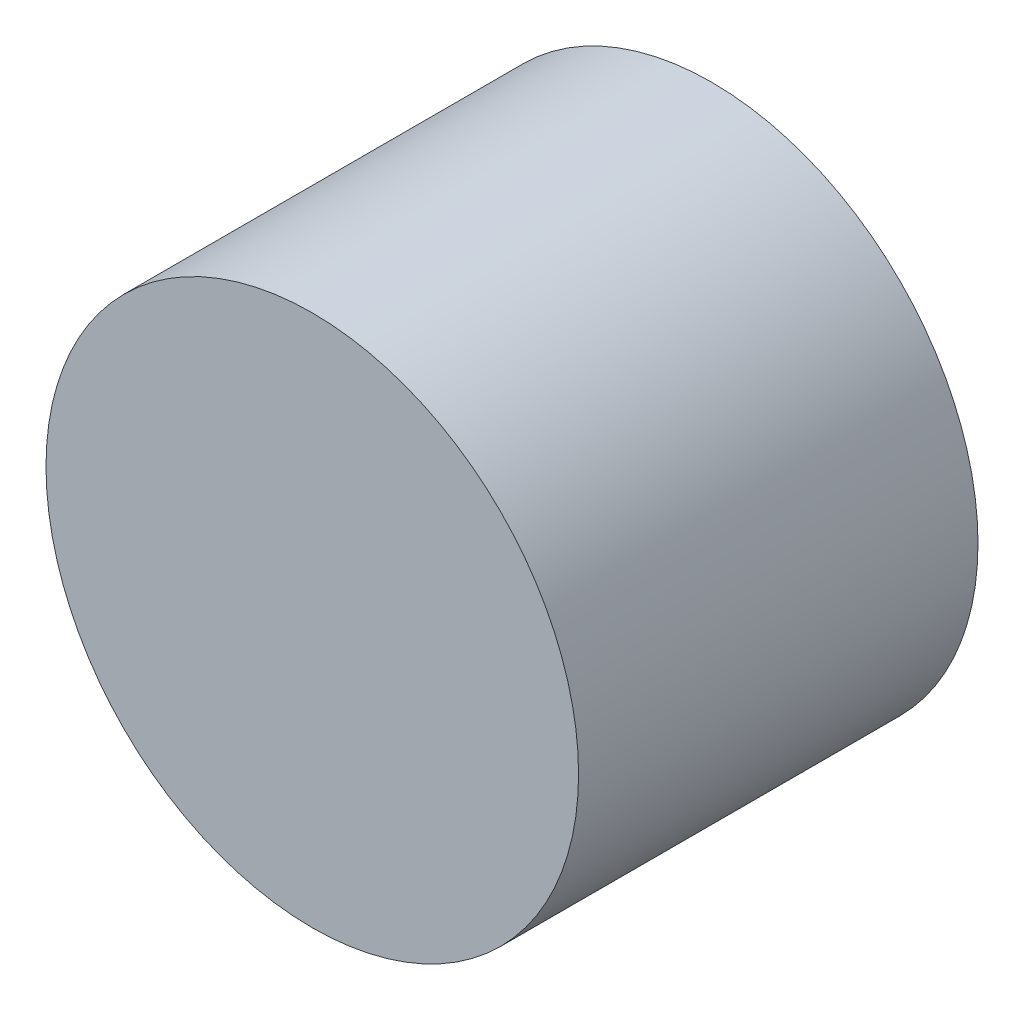
ISO-10303-21;
HEADER;
FILE_DESCRIPTION(('STEP AP214'),'2;1');
FILE_NAME('part.step','',(''),(''),'','','');
FILE_SCHEMA(('AUTOMOTIVE_DESIGN { 1 0 10303 214 1 1 1 1 }'));
ENDSEC;
DATA;
#1=APPLICATION_CONTEXT('core data for automotive mechanical design processes');
#2=APPLICATION_PROTOCOL_DEFINITION('international standard','automotive_design',2000,#1);
#3=PRODUCT_CONTEXT('',#1,'mechanical');
#4=PRODUCT('Part','Part','',(#3));
#5=PRODUCT_RELATED_PRODUCT_CATEGORY('part','',(#4));
#6=PRODUCT_DEFINITION_FORMATION('','',#4);
#7=PRODUCT_DEFINITION_CONTEXT('part definition',#1,'design');
#8=PRODUCT_DEFINITION('design','',#6,#7);
#9=PRODUCT_DEFINITION_SHAPE('','',#8);
#10=(LENGTH_UNIT() NAMED_UNIT(*) SI_UNIT(.MILLI.,.METRE.));
#11=(NAMED_UNIT(*) PLANE_ANGLE_UNIT() SI_UNIT($,.RADIAN.));
#12=(NAMED_UNIT(*) SI_UNIT($,.STERADIAN.) SOLID_ANGLE_UNIT());
#13=UNCERTAINTY_MEASURE_WITH_UNIT(LENGTH_MEASURE(1.E-05),#10,'distance_accuracy_value','');
#14=(GEOMETRIC_REPRESENTATION_CONTEXT(3) GLOBAL_UNCERTAINTY_ASSIGNED_CONTEXT((#13)) GLOBAL_UNIT_ASSIGNED_CONTEXT((#10,
#11,#12)) REPRESENTATION_CONTEXT('',''));
#15=CARTESIAN_POINT('',(0.,0.,0.));
#16=DIRECTION('',(0.,0.,1.));
#17=DIRECTION('',(1.,0.,0.));
#18=AXIS2_PLACEMENT_3D('',#15,#16,#17);
#19=CARTESIAN_POINT('',(0.,0.,45.));
#20=DIRECTION('',(0.,0.,-1.));
#21=DIRECTION('',(-1.,0.,0.));
#22=AXIS2_PLACEMENT_3D('',#19,#20,#21);
#23=CYLINDRICAL_SURFACE('',#22,30.);
#24=CARTESIAN_POINT('',(0.,0.,45.));
#25=DIRECTION('',(0.,0.,1.));
#26=DIRECTION('',(1.,0.,0.));
#27=AXIS2_PLACEMENT_3D('',#24,#25,#26);
#28=CIRCLE('',#27,30.);
#29=CARTESIAN_POINT('',(-30.,0.,45.));
#30=VERTEX_POINT('',#29);
#31=EDGE_CURVE('E10',#30,#30,#28,.T.);
#32=CARTESIAN_POINT('',(0.,0.,0.));
#33=DIRECTION('',(0.,0.,1.));
#34=DIRECTION('',(1.,0.,0.));
#35=AXIS2_PLACEMENT_3D('',#32,#33,#34);
#36=CIRCLE('',#35,30.);
#37=CARTESIAN_POINT('',(-30.,0.,0.));
#38=VERTEX_POINT('',#37);
#39=EDGE_CURVE('E42',#38,#38,#36,.T.);
#40=CARTESIAN_POINT('',(-30.,0.,45.));
#41=CARTESIAN_POINT('',(-30.,0.,44.53125));
#42=CARTESIAN_POINT('',(-30.,0.,44.0625));
#43=CARTESIAN_POINT('',(-30.,0.,43.125));
#44=CARTESIAN_POINT('',(-30.,0.,42.65625));
#45=CARTESIAN_POINT('',(-30.,0.,41.71875));
#46=CARTESIAN_POINT('',(-30.,0.,41.25));
#47=CARTESIAN_POINT('',(-30.,0.,40.3125));
#48=CARTESIAN_POINT('',(-30.,0.,39.84375));
#49=CARTESIAN_POINT('',(-30.,0.,38.90625));
#50=CARTESIAN_POINT('',(-30.,0.,38.4375));
#51=CARTESIAN_POINT('',(-30.,0.,37.5));
#52=CARTESIAN_POINT('',(-30.,0.,37.03125));
#53=CARTESIAN_POINT('',(-30.,0.,36.09375));
#54=CARTESIAN_POINT('',(-30.,0.,35.625));
#55=CARTESIAN_POINT('',(-30.,0.,34.6875));
#56=CARTESIAN_POINT('',(-30.,0.,34.21875));
#57=CARTESIAN_POINT('',(-30.,0.,33.28125));
#58=CARTESIAN_POINT('',(-30.,0.,32.8125));
#59=CARTESIAN_POINT('',(-30.,0.,31.875));
#60=CARTESIAN_POINT('',(-30.,0.,31.40625));
#61=CARTESIAN_POINT('',(-30.,0.,30.46875));
#62=CARTESIAN_POINT('',(-30.,0.,30.));
#63=CARTESIAN_POINT('',(-30.,0.,29.0625));
#64=CARTESIAN_POINT('',(-30.,0.,28.59375));
#65=CARTESIAN_POINT('',(-30.,0.,27.65625));
#66=CARTESIAN_POINT('',(-30.,0.,27.1875));
#67=CARTESIAN_POINT('',(-30.,0.,26.25));
#68=CARTESIAN_POINT('',(-30.,0.,25.78125));
#69=CARTESIAN_POINT('',(-30.,0.,24.84375));
#70=CARTESIAN_POINT('',(-30.,0.,24.375));
#71=CARTESIAN_POINT('',(-30.,0.,23.4375));
#72=CARTESIAN_POINT('',(-30.,0.,22.96875));
#73=CARTESIAN_POINT('',(-30.,0.,22.03125));
#74=CARTESIAN_POINT('',(-30.,0.,21.5625));
#75=CARTESIAN_POINT('',(-30.,0.,20.625));
#76=CARTESIAN_POINT('',(-30.,0.,20.15625));
#77=CARTESIAN_POINT('',(-30.,0.,19.21875));
#78=CARTESIAN_POINT('',(-30.,0.,18.75));
#79=CARTESIAN_POINT('',(-30.,0.,17.8125));
#80=CARTESIAN_POINT('',(-30.,0.,17.34375));
#81=CARTESIAN_POINT('',(-30.,0.,16.40625));
#82=CARTESIAN_POINT('',(-30.,0.,15.9375));
#83=CARTESIAN_POINT('',(-30.,0.,15.));
#84=CARTESIAN_POINT('',(-30.,0.,14.53125));
#85=CARTESIAN_POINT('',(-30.,0.,13.59375));
#86=CARTESIAN_POINT('',(-30.,0.,13.125));
#87=CARTESIAN_POINT('',(-30.,0.,12.1875));
#88=CARTESIAN_POINT('',(-30.,0.,11.71875));
#89=CARTESIAN_POINT('',(-30.,0.,10.78125));
#90=CARTESIAN_POINT('',(-30.,0.,10.3125));
#91=CARTESIAN_POINT('',(-30.,0.,9.375));
#92=CARTESIAN_POINT('',(-30.,0.,8.90625));
#93=CARTESIAN_POINT('',(-30.,0.,7.96874999999999));
#94=CARTESIAN_POINT('',(-30.,0.,7.5));
#95=CARTESIAN_POINT('',(-30.,0.,6.5625));
#96=CARTESIAN_POINT('',(-30.,0.,6.09375));
#97=CARTESIAN_POINT('',(-30.,0.,5.15625));
#98=CARTESIAN_POINT('',(-30.,0.,4.68749999999999));
#99=CARTESIAN_POINT('',(-30.,0.,3.74999999999999));
#100=CARTESIAN_POINT('',(-30.,0.,3.28124999999999));
#101=CARTESIAN_POINT('',(-30.,0.,2.34374999999999));
#102=CARTESIAN_POINT('',(-30.,0.,1.87499999999999));
#103=CARTESIAN_POINT('',(-30.,0.,0.937499999999992));
#104=CARTESIAN_POINT('',(-30.,0.,0.468749999999993));
#105=CARTESIAN_POINT('',(-30.,0.,0.));
#106=B_SPLINE_CURVE_WITH_KNOTS('',3,(#40,#41,#42,#43,#44,#45,#46,#47,#48,#49,#50,#51,#52,#53,
#54,#55,#56,#57,#58,#59,#60,#61,#62,#63,#64,#65,#66,#67,#68,#69,#70,#71,#72,#73,#74,#75,#76,#77,
#78,#79,#80,#81,#82,#83,#84,#85,#86,#87,#88,#89,#90,#91,#92,#93,#94,#95,#96,#97,#98,#99,#100,
#101,#102,#103,#104,#105),.UNSPECIFIED.,.F.,.F.,(4,2,2,2,2,2,2,2,2,2,2,2,2,2,2,2,2,2,2,2,2,2,2,
2,2,2,2,2,2,2,2,2,4),(0.,1.40625,2.8125,4.21875000000001,5.62500000000001,7.03125,8.4375,
9.84375000000001,11.25,12.65625,14.0625,15.46875,16.875,18.28125,19.6875,21.09375,22.5,23.90625,
25.3125,26.71875,28.125,29.53125,30.9375,32.34375,33.75,35.15625,36.5625,37.96875,39.375,
40.78125,42.1875,43.59375,45.),.UNSPECIFIED.);
#107=EDGE_CURVE('BSEAM39',#30,#38,#106,.T.);
#108=ORIENTED_EDGE('',*,*,#31,.F.);
#109=ORIENTED_EDGE('',*,*,#39,.T.);
#110=ORIENTED_EDGE('',*,*,#107,.T.);
#111=ORIENTED_EDGE('',*,*,#107,.F.);
#112=EDGE_LOOP('',(#108,#110,#109,#111));
#113=FACE_BOUND('',#112,.T.);
#114=ADVANCED_FACE('F39',(#113),#23,.T.);
#115=CARTESIAN_POINT('',(0.,0.,45.));
#116=DIRECTION('',(0.,0.,1.));
#117=DIRECTION('',(1.,0.,0.));
#118=AXIS2_PLACEMENT_3D('',#115,#116,#117);
#119=PLANE('',#118);
#120=ORIENTED_EDGE('',*,*,#31,.T.);
#121=EDGE_LOOP('',(#120));
#122=FACE_BOUND('',#121,.T.);
#123=ADVANCED_FACE('F56',(#122),#119,.T.);
#124=CARTESIAN_POINT('',(0.,0.,0.));
#125=DIRECTION('',(0.,0.,1.));
#126=DIRECTION('',(1.,0.,0.));
#127=AXIS2_PLACEMENT_3D('',#124,#125,#126);
#128=PLANE('',#127);
#129=ORIENTED_EDGE('',*,*,#39,.F.);
#130=EDGE_LOOP('',(#129));
#131=FACE_BOUND('',#130,.T.);
#132=ADVANCED_FACE('F54',(#131),#128,.F.);
#133=CLOSED_SHELL('',(#114,#123,#132));
#134=MANIFOLD_SOLID_BREP('B2',#133);
#135=ADVANCED_BREP_SHAPE_REPRESENTATION('',(#18,#134),#14);
#136=SHAPE_DEFINITION_REPRESENTATION(#9,#135);
ENDSEC;
END-ISO-10303-21;
